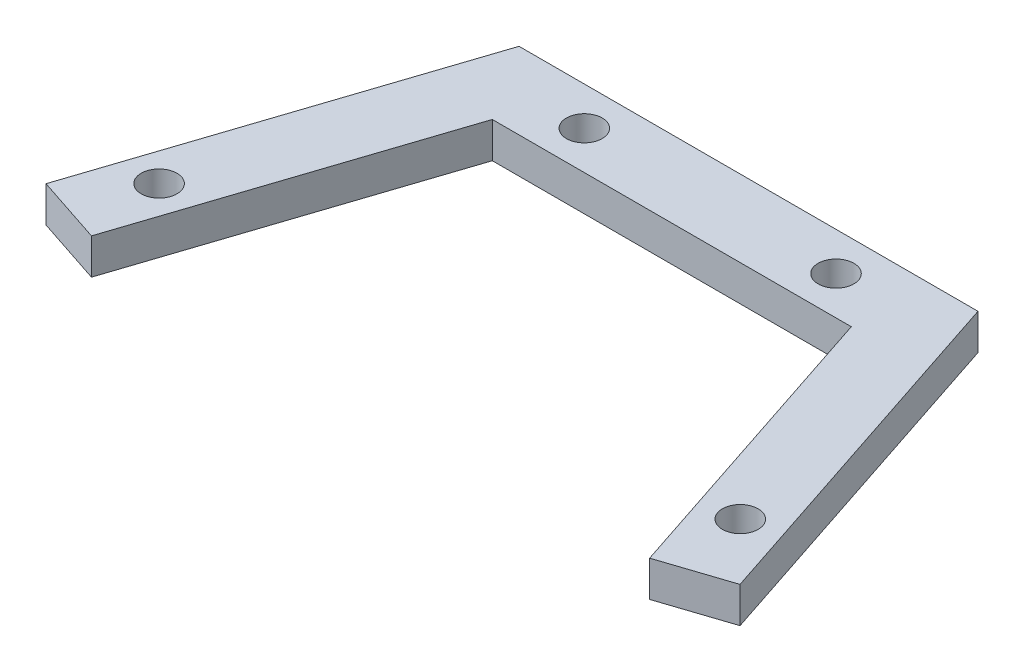
ISO-10303-21;
HEADER;
FILE_DESCRIPTION(('STEP AP214'),'2;1');
FILE_NAME('part.step','',(''),(''),'','','');
FILE_SCHEMA(('AUTOMOTIVE_DESIGN { 1 0 10303 214 1 1 1 1 }'));
ENDSEC;
DATA;
#1=APPLICATION_CONTEXT('core data for automotive mechanical design processes');
#2=APPLICATION_PROTOCOL_DEFINITION('international standard','automotive_design',2000,#1);
#3=PRODUCT_CONTEXT('',#1,'mechanical');
#4=PRODUCT('Part','Part','',(#3));
#5=PRODUCT_RELATED_PRODUCT_CATEGORY('part','',(#4));
#6=PRODUCT_DEFINITION_FORMATION('','',#4);
#7=PRODUCT_DEFINITION_CONTEXT('part definition',#1,'design');
#8=PRODUCT_DEFINITION('design','',#6,#7);
#9=PRODUCT_DEFINITION_SHAPE('','',#8);
#10=(LENGTH_UNIT() NAMED_UNIT(*) SI_UNIT(.MILLI.,.METRE.));
#11=(NAMED_UNIT(*) PLANE_ANGLE_UNIT() SI_UNIT($,.RADIAN.));
#12=(NAMED_UNIT(*) SI_UNIT($,.STERADIAN.) SOLID_ANGLE_UNIT());
#13=UNCERTAINTY_MEASURE_WITH_UNIT(LENGTH_MEASURE(1.E-05),#10,'distance_accuracy_value','');
#14=(GEOMETRIC_REPRESENTATION_CONTEXT(3) GLOBAL_UNCERTAINTY_ASSIGNED_CONTEXT((#13)) GLOBAL_UNIT_ASSIGNED_CONTEXT((#10,
#11,#12)) REPRESENTATION_CONTEXT('',''));
#15=CARTESIAN_POINT('',(0.,0.,0.));
#16=DIRECTION('',(0.,0.,1.));
#17=DIRECTION('',(1.,0.,0.));
#18=AXIS2_PLACEMENT_3D('',#15,#16,#17);
#19=CARTESIAN_POINT('',(0.,2.,0.));
#20=DIRECTION('',(0.,-1.,0.));
#21=DIRECTION('',(0.,0.,-1.));
#22=AXIS2_PLACEMENT_3D('',#19,#20,#21);
#23=PLANE('',#22);
#24=DIRECTION('',(-1.,0.,0.));
#25=VECTOR('',#24,1.);
#26=CARTESIAN_POINT('',(20.075,2.,-4.29));
#27=LINE('',#26,#25);
#28=CARTESIAN_POINT('',(25.66430999084,2.,-4.29000000000001));
#29=VERTEX_POINT('',#28);
#30=CARTESIAN_POINT('',(-25.66430999084,2.,-4.29));
#31=VERTEX_POINT('',#30);
#32=EDGE_CURVE('E98',#29,#31,#27,.T.);
#33=ORIENTED_EDGE('',*,*,#32,.T.);
#34=DIRECTION('',(-0.313890169032213,0.,0.949459299699007));
#35=VECTOR('',#34,1.);
#36=CARTESIAN_POINT('',(-25.66430999084,2.,-4.29));
#37=LINE('',#36,#35);
#38=CARTESIAN_POINT('',(-38.8089585510537,2.,35.4701137214632));
#39=VERTEX_POINT('',#38);
#40=EDGE_CURVE('E183',#31,#39,#37,.T.);
#41=ORIENTED_EDGE('',*,*,#40,.T.);
#42=DIRECTION('',(0.949459299699007,0.,0.313890169032213));
#43=VECTOR('',#42,1.);
#44=CARTESIAN_POINT('',(-38.8089585510537,2.,35.4701137214632));
#45=LINE('',#44,#43);
#46=CARTESIAN_POINT('',(-31.2132841534617,2.,37.9812350737209));
#47=VERTEX_POINT('',#46);
#48=EDGE_CURVE('E166',#39,#47,#45,.T.);
#49=ORIENTED_EDGE('',*,*,#48,.T.);
#50=DIRECTION('',(0.313890169032213,0.,-0.949459299699007));
#51=VECTOR('',#50,1.);
#52=CARTESIAN_POINT('',(-31.2132841534617,2.,37.9812350737209));
#53=LINE('',#52,#51);
#54=CARTESIAN_POINT('',(-20.075,2.,4.29));
#55=VERTEX_POINT('',#54);
#56=EDGE_CURVE('E179',#47,#55,#53,.T.);
#57=ORIENTED_EDGE('',*,*,#56,.T.);
#58=DIRECTION('',(1.,0.,0.));
#59=VECTOR('',#58,1.);
#60=CARTESIAN_POINT('',(-20.075,2.,4.29));
#61=LINE('',#60,#59);
#62=CARTESIAN_POINT('',(20.075,2.,4.29));
#63=VERTEX_POINT('',#62);
#64=EDGE_CURVE('E118',#55,#63,#61,.T.);
#65=ORIENTED_EDGE('',*,*,#64,.T.);
#66=DIRECTION('',(0.313890169032213,0.,0.949459299699007));
#67=VECTOR('',#66,1.);
#68=CARTESIAN_POINT('',(31.2132841534617,2.,37.9812350737209));
#69=LINE('',#68,#67);
#70=CARTESIAN_POINT('',(31.2132841534617,2.,37.9812350737209));
#71=VERTEX_POINT('',#70);
#72=EDGE_CURVE('E112',#63,#71,#69,.T.);
#73=ORIENTED_EDGE('',*,*,#72,.T.);
#74=DIRECTION('',(0.949459299699007,0.,-0.313890169032212));
#75=VECTOR('',#74,1.);
#76=CARTESIAN_POINT('',(38.8089585510537,2.,35.4701137214632));
#77=LINE('',#76,#75);
#78=CARTESIAN_POINT('',(38.8089585510537,2.,35.4701137214632));
#79=VERTEX_POINT('',#78);
#80=EDGE_CURVE('E116',#71,#79,#77,.T.);
#81=ORIENTED_EDGE('',*,*,#80,.T.);
#82=DIRECTION('',(-0.313890169032213,0.,-0.949459299699007));
#83=VECTOR('',#82,1.);
#84=CARTESIAN_POINT('',(25.66430999084,2.,-4.29000000000001));
#85=LINE('',#84,#83);
#86=EDGE_CURVE('E56',#79,#29,#85,.T.);
#87=ORIENTED_EDGE('',*,*,#86,.T.);
#88=EDGE_LOOP('',(#33,#41,#49,#57,#65,#73,#81,#87));
#89=FACE_BOUND('',#88,.T.);
#90=CARTESIAN_POINT('',(14.075,2.,0.));
#91=DIRECTION('',(0.,1.,0.));
#92=DIRECTION('',(0.,0.,1.));
#93=AXIS2_PLACEMENT_3D('',#90,#91,#92);
#94=CIRCLE('',#93,2.);
#95=CARTESIAN_POINT('',(14.075,2.,2.));
#96=VERTEX_POINT('',#95);
#97=EDGE_CURVE('E138',#96,#96,#94,.T.);
#98=ORIENTED_EDGE('',*,*,#97,.F.);
#99=EDGE_LOOP('',(#98));
#100=FACE_BOUND('',#99,.T.);
#101=CARTESIAN_POINT('',(-14.075,2.,0.));
#102=DIRECTION('',(0.,1.,0.));
#103=DIRECTION('',(0.,0.,-1.));
#104=AXIS2_PLACEMENT_3D('',#101,#102,#103);
#105=CIRCLE('',#104,2.);
#106=CARTESIAN_POINT('',(-14.075,2.,-2.));
#107=VERTEX_POINT('',#106);
#108=EDGE_CURVE('E189',#107,#107,#105,.T.);
#109=ORIENTED_EDGE('',*,*,#108,.F.);
#110=EDGE_LOOP('',(#109));
#111=FACE_BOUND('',#110,.T.);
#112=CARTESIAN_POINT('',(-32.5,2.,29.13));
#113=DIRECTION('',(0.,1.,0.));
#114=DIRECTION('',(0.,0.,1.));
#115=AXIS2_PLACEMENT_3D('',#112,#113,#114);
#116=CIRCLE('',#115,2.);
#117=CARTESIAN_POINT('',(-32.5,2.,31.13));
#118=VERTEX_POINT('',#117);
#119=EDGE_CURVE('E195',#118,#118,#116,.T.);
#120=ORIENTED_EDGE('',*,*,#119,.F.);
#121=EDGE_LOOP('',(#120));
#122=FACE_BOUND('',#121,.T.);
#123=CARTESIAN_POINT('',(32.5,2.,29.13));
#124=DIRECTION('',(0.,1.,0.));
#125=DIRECTION('',(0.,0.,-1.));
#126=AXIS2_PLACEMENT_3D('',#123,#124,#125);
#127=CIRCLE('',#126,2.);
#128=CARTESIAN_POINT('',(32.5,2.,27.13));
#129=VERTEX_POINT('',#128);
#130=EDGE_CURVE('E201',#129,#129,#127,.T.);
#131=ORIENTED_EDGE('',*,*,#130,.F.);
#132=EDGE_LOOP('',(#131));
#133=FACE_BOUND('',#132,.T.);
#134=ADVANCED_FACE('F39',(#89,#100,#111,#122,#133),#23,.F.);
#135=CARTESIAN_POINT('',(0.,-2.,0.));
#136=DIRECTION('',(0.,-1.,0.));
#137=DIRECTION('',(0.,0.,-1.));
#138=AXIS2_PLACEMENT_3D('',#135,#136,#137);
#139=PLANE('',#138);
#140=CARTESIAN_POINT('',(-32.5,-2.,29.13));
#141=DIRECTION('',(0.,1.,0.));
#142=DIRECTION('',(0.,0.,1.));
#143=AXIS2_PLACEMENT_3D('',#140,#141,#142);
#144=CIRCLE('',#143,2.);
#145=CARTESIAN_POINT('',(-32.5,-2.,31.13));
#146=VERTEX_POINT('',#145);
#147=EDGE_CURVE('E198',#146,#146,#144,.T.);
#148=ORIENTED_EDGE('',*,*,#147,.T.);
#149=EDGE_LOOP('',(#148));
#150=FACE_BOUND('',#149,.T.);
#151=CARTESIAN_POINT('',(14.075,-2.,0.));
#152=DIRECTION('',(0.,1.,0.));
#153=DIRECTION('',(0.,0.,1.));
#154=AXIS2_PLACEMENT_3D('',#151,#152,#153);
#155=CIRCLE('',#154,2.);
#156=CARTESIAN_POINT('',(14.075,-2.,2.));
#157=VERTEX_POINT('',#156);
#158=EDGE_CURVE('E186',#157,#157,#155,.T.);
#159=ORIENTED_EDGE('',*,*,#158,.T.);
#160=EDGE_LOOP('',(#159));
#161=FACE_BOUND('',#160,.T.);
#162=DIRECTION('',(-1.,0.,0.));
#163=VECTOR('',#162,1.);
#164=CARTESIAN_POINT('',(-20.075,-2.,-4.29));
#165=LINE('',#164,#163);
#166=CARTESIAN_POINT('',(25.66430999084,-2.,-4.29000000000001));
#167=VERTEX_POINT('',#166);
#168=CARTESIAN_POINT('',(-25.66430999084,-2.,-4.29));
#169=VERTEX_POINT('',#168);
#170=EDGE_CURVE('E92',#167,#169,#165,.T.);
#171=ORIENTED_EDGE('',*,*,#170,.F.);
#172=DIRECTION('',(-0.313890169032213,0.,-0.949459299699007));
#173=VECTOR('',#172,1.);
#174=CARTESIAN_POINT('',(25.66430999084,-2.,-4.29000000000001));
#175=LINE('',#174,#173);
#176=CARTESIAN_POINT('',(38.8089585510537,-2.,35.4701137214632));
#177=VERTEX_POINT('',#176);
#178=EDGE_CURVE('E148',#177,#167,#175,.T.);
#179=ORIENTED_EDGE('',*,*,#178,.F.);
#180=DIRECTION('',(0.949459299699007,0.,-0.313890169032212));
#181=VECTOR('',#180,1.);
#182=CARTESIAN_POINT('',(38.8089585510537,-2.,35.4701137214632));
#183=LINE('',#182,#181);
#184=CARTESIAN_POINT('',(31.2132841534617,-2.,37.9812350737209));
#185=VERTEX_POINT('',#184);
#186=EDGE_CURVE('E85',#185,#177,#183,.T.);
#187=ORIENTED_EDGE('',*,*,#186,.F.);
#188=DIRECTION('',(0.313890169032213,0.,0.949459299699007));
#189=VECTOR('',#188,1.);
#190=CARTESIAN_POINT('',(31.2132841534617,-2.,37.9812350737209));
#191=LINE('',#190,#189);
#192=CARTESIAN_POINT('',(20.075,-2.,4.29));
#193=VERTEX_POINT('',#192);
#194=EDGE_CURVE('E126',#193,#185,#191,.T.);
#195=ORIENTED_EDGE('',*,*,#194,.F.);
#196=DIRECTION('',(1.,0.,0.));
#197=VECTOR('',#196,1.);
#198=CARTESIAN_POINT('',(-20.075,-2.,4.29));
#199=LINE('',#198,#197);
#200=CARTESIAN_POINT('',(-20.075,-2.,4.29));
#201=VERTEX_POINT('',#200);
#202=EDGE_CURVE('E144',#201,#193,#199,.T.);
#203=ORIENTED_EDGE('',*,*,#202,.F.);
#204=DIRECTION('',(0.313890169032213,0.,-0.949459299699007));
#205=VECTOR('',#204,1.);
#206=CARTESIAN_POINT('',(-31.2132841534617,-2.,37.9812350737209));
#207=LINE('',#206,#205);
#208=CARTESIAN_POINT('',(-31.2132841534617,-2.,37.9812350737209));
#209=VERTEX_POINT('',#208);
#210=EDGE_CURVE('E142',#209,#201,#207,.T.);
#211=ORIENTED_EDGE('',*,*,#210,.F.);
#212=DIRECTION('',(0.949459299699007,0.,0.313890169032213));
#213=VECTOR('',#212,1.);
#214=CARTESIAN_POINT('',(-38.8089585510537,-2.,35.4701137214632));
#215=LINE('',#214,#213);
#216=CARTESIAN_POINT('',(-38.8089585510537,-2.,35.4701137214632));
#217=VERTEX_POINT('',#216);
#218=EDGE_CURVE('E140',#217,#209,#215,.T.);
#219=ORIENTED_EDGE('',*,*,#218,.F.);
#220=DIRECTION('',(-0.313890169032213,0.,0.949459299699007));
#221=VECTOR('',#220,1.);
#222=CARTESIAN_POINT('',(-25.66430999084,-2.,-4.29));
#223=LINE('',#222,#221);
#224=EDGE_CURVE('E137',#169,#217,#223,.T.);
#225=ORIENTED_EDGE('',*,*,#224,.F.);
#226=EDGE_LOOP('',(#171,#179,#187,#195,#203,#211,#219,#225));
#227=FACE_BOUND('',#226,.T.);
#228=CARTESIAN_POINT('',(-14.075,-2.,0.));
#229=DIRECTION('',(0.,1.,0.));
#230=DIRECTION('',(0.,0.,-1.));
#231=AXIS2_PLACEMENT_3D('',#228,#229,#230);
#232=CIRCLE('',#231,2.);
#233=CARTESIAN_POINT('',(-14.075,-2.,-2.));
#234=VERTEX_POINT('',#233);
#235=EDGE_CURVE('E192',#234,#234,#232,.T.);
#236=ORIENTED_EDGE('',*,*,#235,.T.);
#237=EDGE_LOOP('',(#236));
#238=FACE_BOUND('',#237,.T.);
#239=CARTESIAN_POINT('',(32.5,-2.,29.13));
#240=DIRECTION('',(0.,1.,0.));
#241=DIRECTION('',(0.,0.,-1.));
#242=AXIS2_PLACEMENT_3D('',#239,#240,#241);
#243=CIRCLE('',#242,2.);
#244=CARTESIAN_POINT('',(32.5,-2.,27.13));
#245=VERTEX_POINT('',#244);
#246=EDGE_CURVE('E204',#245,#245,#243,.T.);
#247=ORIENTED_EDGE('',*,*,#246,.T.);
#248=EDGE_LOOP('',(#247));
#249=FACE_BOUND('',#248,.T.);
#250=ADVANCED_FACE('F170',(#150,#161,#227,#238,#249),#139,.T.);
#251=CARTESIAN_POINT('',(-20.075,2.,-4.29));
#252=DIRECTION('',(0.,0.,1.));
#253=DIRECTION('',(1.,0.,0.));
#254=AXIS2_PLACEMENT_3D('',#251,#252,#253);
#255=PLANE('',#254);
#256=ORIENTED_EDGE('',*,*,#170,.T.);
#257=DIRECTION('',(0.,-1.,0.));
#258=VECTOR('',#257,1.);
#259=CARTESIAN_POINT('',(-25.66430999084,2.,-4.29));
#260=LINE('',#259,#258);
#261=EDGE_CURVE('E11',#31,#169,#260,.T.);
#262=ORIENTED_EDGE('',*,*,#261,.F.);
#263=ORIENTED_EDGE('',*,*,#32,.F.);
#264=DIRECTION('',(0.,-1.,0.));
#265=VECTOR('',#264,1.);
#266=CARTESIAN_POINT('',(25.66430999084,2.,-4.29000000000001));
#267=LINE('',#266,#265);
#268=EDGE_CURVE('E132',#29,#167,#267,.T.);
#269=ORIENTED_EDGE('',*,*,#268,.T.);
#270=EDGE_LOOP('',(#256,#262,#263,#269));
#271=FACE_BOUND('',#270,.T.);
#272=ADVANCED_FACE('F41',(#271),#255,.F.);
#273=CARTESIAN_POINT('',(-25.66430999084,2.,-4.29));
#274=DIRECTION('',(0.949459299699007,0.,0.313890169032213));
#275=DIRECTION('',(0.313890169032213,0.,-0.949459299699007));
#276=AXIS2_PLACEMENT_3D('',#273,#274,#275);
#277=PLANE('',#276);
#278=ORIENTED_EDGE('',*,*,#224,.T.);
#279=DIRECTION('',(0.,-1.,0.));
#280=VECTOR('',#279,1.);
#281=CARTESIAN_POINT('',(-38.8089585510537,2.,35.4701137214632));
#282=LINE('',#281,#280);
#283=EDGE_CURVE('E48',#39,#217,#282,.T.);
#284=ORIENTED_EDGE('',*,*,#283,.F.);
#285=ORIENTED_EDGE('',*,*,#40,.F.);
#286=ORIENTED_EDGE('',*,*,#261,.T.);
#287=EDGE_LOOP('',(#278,#284,#285,#286));
#288=FACE_BOUND('',#287,.T.);
#289=ADVANCED_FACE('F237',(#288),#277,.F.);
#290=CARTESIAN_POINT('',(-38.8089585510537,2.,35.4701137214632));
#291=DIRECTION('',(0.313890169032213,0.,-0.949459299699007));
#292=DIRECTION('',(-0.949459299699007,0.,-0.313890169032213));
#293=AXIS2_PLACEMENT_3D('',#290,#291,#292);
#294=PLANE('',#293);
#295=ORIENTED_EDGE('',*,*,#218,.T.);
#296=DIRECTION('',(0.,-1.,0.));
#297=VECTOR('',#296,1.);
#298=CARTESIAN_POINT('',(-31.2132841534617,2.,37.9812350737209));
#299=LINE('',#298,#297);
#300=EDGE_CURVE('E157',#47,#209,#299,.T.);
#301=ORIENTED_EDGE('',*,*,#300,.F.);
#302=ORIENTED_EDGE('',*,*,#48,.F.);
#303=ORIENTED_EDGE('',*,*,#283,.T.);
#304=EDGE_LOOP('',(#295,#301,#302,#303));
#305=FACE_BOUND('',#304,.T.);
#306=ADVANCED_FACE('F164',(#305),#294,.F.);
#307=CARTESIAN_POINT('',(-31.2132841534617,2.,37.9812350737209));
#308=DIRECTION('',(-0.949459299699007,0.,-0.313890169032213));
#309=DIRECTION('',(-0.313890169032213,0.,0.949459299699007));
#310=AXIS2_PLACEMENT_3D('',#307,#308,#309);
#311=PLANE('',#310);
#312=ORIENTED_EDGE('',*,*,#210,.T.);
#313=DIRECTION('',(0.,-1.,0.));
#314=VECTOR('',#313,1.);
#315=CARTESIAN_POINT('',(-20.075,2.,4.29));
#316=LINE('',#315,#314);
#317=EDGE_CURVE('E154',#55,#201,#316,.T.);
#318=ORIENTED_EDGE('',*,*,#317,.F.);
#319=ORIENTED_EDGE('',*,*,#56,.F.);
#320=ORIENTED_EDGE('',*,*,#300,.T.);
#321=EDGE_LOOP('',(#312,#318,#319,#320));
#322=FACE_BOUND('',#321,.T.);
#323=ADVANCED_FACE('F175',(#322),#311,.F.);
#324=CARTESIAN_POINT('',(-20.075,2.,4.29));
#325=DIRECTION('',(0.,0.,-1.));
#326=DIRECTION('',(-1.,0.,0.));
#327=AXIS2_PLACEMENT_3D('',#324,#325,#326);
#328=PLANE('',#327);
#329=ORIENTED_EDGE('',*,*,#202,.T.);
#330=DIRECTION('',(0.,-1.,0.));
#331=VECTOR('',#330,1.);
#332=CARTESIAN_POINT('',(20.075,2.,4.29));
#333=LINE('',#332,#331);
#334=EDGE_CURVE('E127',#63,#193,#333,.T.);
#335=ORIENTED_EDGE('',*,*,#334,.F.);
#336=ORIENTED_EDGE('',*,*,#64,.F.);
#337=ORIENTED_EDGE('',*,*,#317,.T.);
#338=EDGE_LOOP('',(#329,#335,#336,#337));
#339=FACE_BOUND('',#338,.T.);
#340=ADVANCED_FACE('F178',(#339),#328,.F.);
#341=CARTESIAN_POINT('',(31.2132841534617,2.,37.9812350737209));
#342=DIRECTION('',(0.949459299699007,0.,-0.313890169032213));
#343=DIRECTION('',(-0.313890169032213,0.,-0.949459299699007));
#344=AXIS2_PLACEMENT_3D('',#341,#342,#343);
#345=PLANE('',#344);
#346=ORIENTED_EDGE('',*,*,#194,.T.);
#347=DIRECTION('',(0.,-1.,0.));
#348=VECTOR('',#347,1.);
#349=CARTESIAN_POINT('',(31.2132841534617,2.,37.9812350737209));
#350=LINE('',#349,#348);
#351=EDGE_CURVE('E123',#71,#185,#350,.T.);
#352=ORIENTED_EDGE('',*,*,#351,.F.);
#353=ORIENTED_EDGE('',*,*,#72,.F.);
#354=ORIENTED_EDGE('',*,*,#334,.T.);
#355=EDGE_LOOP('',(#346,#352,#353,#354));
#356=FACE_BOUND('',#355,.T.);
#357=ADVANCED_FACE('F124',(#356),#345,.F.);
#358=CARTESIAN_POINT('',(38.8089585510537,2.,35.4701137214632));
#359=DIRECTION('',(-0.313890169032212,0.,-0.949459299699007));
#360=DIRECTION('',(-0.949459299699007,0.,0.313890169032212));
#361=AXIS2_PLACEMENT_3D('',#358,#359,#360);
#362=PLANE('',#361);
#363=ORIENTED_EDGE('',*,*,#186,.T.);
#364=DIRECTION('',(0.,-1.,0.));
#365=VECTOR('',#364,1.);
#366=CARTESIAN_POINT('',(38.8089585510537,2.,35.4701137214632));
#367=LINE('',#366,#365);
#368=EDGE_CURVE('E128',#79,#177,#367,.T.);
#369=ORIENTED_EDGE('',*,*,#368,.F.);
#370=ORIENTED_EDGE('',*,*,#80,.F.);
#371=ORIENTED_EDGE('',*,*,#351,.T.);
#372=EDGE_LOOP('',(#363,#369,#370,#371));
#373=FACE_BOUND('',#372,.T.);
#374=ADVANCED_FACE('F130',(#373),#362,.F.);
#375=CARTESIAN_POINT('',(25.66430999084,2.,-4.29000000000001));
#376=DIRECTION('',(-0.949459299699007,0.,0.313890169032213));
#377=DIRECTION('',(0.313890169032213,0.,0.949459299699007));
#378=AXIS2_PLACEMENT_3D('',#375,#376,#377);
#379=PLANE('',#378);
#380=ORIENTED_EDGE('',*,*,#178,.T.);
#381=ORIENTED_EDGE('',*,*,#268,.F.);
#382=ORIENTED_EDGE('',*,*,#86,.F.);
#383=ORIENTED_EDGE('',*,*,#368,.T.);
#384=EDGE_LOOP('',(#380,#381,#382,#383));
#385=FACE_BOUND('',#384,.T.);
#386=ADVANCED_FACE('F224',(#385),#379,.F.);
#387=CARTESIAN_POINT('',(14.075,2.,0.));
#388=DIRECTION('',(0.,-1.,0.));
#389=DIRECTION('',(0.,0.,-1.));
#390=AXIS2_PLACEMENT_3D('',#387,#388,#389);
#391=CYLINDRICAL_SURFACE('',#390,2.);
#392=ORIENTED_EDGE('',*,*,#97,.T.);
#393=EDGE_LOOP('',(#392));
#394=FACE_BOUND('',#393,.T.);
#395=ORIENTED_EDGE('',*,*,#158,.F.);
#396=EDGE_LOOP('',(#395));
#397=FACE_BOUND('',#396,.T.);
#398=ADVANCED_FACE('F221',(#394,#397),#391,.F.);
#399=CARTESIAN_POINT('',(-14.075,2.,0.));
#400=DIRECTION('',(0.,-1.,0.));
#401=DIRECTION('',(0.,0.,-1.));
#402=AXIS2_PLACEMENT_3D('',#399,#400,#401);
#403=CYLINDRICAL_SURFACE('',#402,2.);
#404=ORIENTED_EDGE('',*,*,#108,.T.);
#405=EDGE_LOOP('',(#404));
#406=FACE_BOUND('',#405,.T.);
#407=ORIENTED_EDGE('',*,*,#235,.F.);
#408=EDGE_LOOP('',(#407));
#409=FACE_BOUND('',#408,.T.);
#410=ADVANCED_FACE('F305',(#406,#409),#403,.F.);
#411=CARTESIAN_POINT('',(-32.5,2.,29.13));
#412=DIRECTION('',(0.,-1.,0.));
#413=DIRECTION('',(0.,0.,-1.));
#414=AXIS2_PLACEMENT_3D('',#411,#412,#413);
#415=CYLINDRICAL_SURFACE('',#414,2.);
#416=ORIENTED_EDGE('',*,*,#119,.T.);
#417=EDGE_LOOP('',(#416));
#418=FACE_BOUND('',#417,.T.);
#419=ORIENTED_EDGE('',*,*,#147,.F.);
#420=EDGE_LOOP('',(#419));
#421=FACE_BOUND('',#420,.T.);
#422=ADVANCED_FACE('F313',(#418,#421),#415,.F.);
#423=CARTESIAN_POINT('',(32.5,2.,29.13));
#424=DIRECTION('',(0.,-1.,0.));
#425=DIRECTION('',(0.,0.,-1.));
#426=AXIS2_PLACEMENT_3D('',#423,#424,#425);
#427=CYLINDRICAL_SURFACE('',#426,2.);
#428=ORIENTED_EDGE('',*,*,#130,.T.);
#429=EDGE_LOOP('',(#428));
#430=FACE_BOUND('',#429,.T.);
#431=ORIENTED_EDGE('',*,*,#246,.F.);
#432=EDGE_LOOP('',(#431));
#433=FACE_BOUND('',#432,.T.);
#434=ADVANCED_FACE('F210',(#430,#433),#427,.F.);
#435=CLOSED_SHELL('',(#134,#250,#272,#289,#306,#323,#340,#357,#374,#386,#398,#410,#422,#434));
#436=MANIFOLD_SOLID_BREP('B2',#435);
#437=ADVANCED_BREP_SHAPE_REPRESENTATION('',(#18,#436),#14);
#438=SHAPE_DEFINITION_REPRESENTATION(#9,#437);
ENDSEC;
END-ISO-10303-21;
